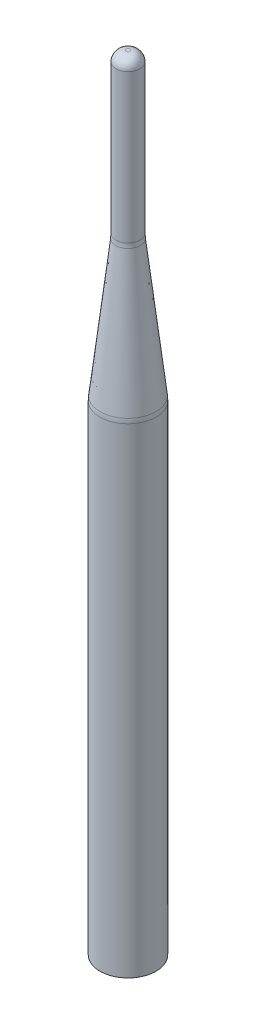
ISO-10303-21;
HEADER;
FILE_DESCRIPTION(('STEP AP214'),'2;1');
FILE_NAME('part.step','',(''),(''),'','','');
FILE_SCHEMA(('AUTOMOTIVE_DESIGN { 1 0 10303 214 1 1 1 1 }'));
ENDSEC;
DATA;
#1=APPLICATION_CONTEXT('core data for automotive mechanical design processes');
#2=APPLICATION_PROTOCOL_DEFINITION('international standard','automotive_design',2000,#1);
#3=PRODUCT_CONTEXT('',#1,'mechanical');
#4=PRODUCT('Part','Part','',(#3));
#5=PRODUCT_RELATED_PRODUCT_CATEGORY('part','',(#4));
#6=PRODUCT_DEFINITION_FORMATION('','',#4);
#7=PRODUCT_DEFINITION_CONTEXT('part definition',#1,'design');
#8=PRODUCT_DEFINITION('design','',#6,#7);
#9=PRODUCT_DEFINITION_SHAPE('','',#8);
#10=(LENGTH_UNIT() NAMED_UNIT(*) SI_UNIT(.MILLI.,.METRE.));
#11=(NAMED_UNIT(*) PLANE_ANGLE_UNIT() SI_UNIT($,.RADIAN.));
#12=(NAMED_UNIT(*) SI_UNIT($,.STERADIAN.) SOLID_ANGLE_UNIT());
#13=UNCERTAINTY_MEASURE_WITH_UNIT(LENGTH_MEASURE(1.E-05),#10,'distance_accuracy_value','');
#14=(GEOMETRIC_REPRESENTATION_CONTEXT(3) GLOBAL_UNCERTAINTY_ASSIGNED_CONTEXT((#13)) GLOBAL_UNIT_ASSIGNED_CONTEXT((#10,
#11,#12)) REPRESENTATION_CONTEXT('',''));
#15=CARTESIAN_POINT('',(0.,0.,0.));
#16=DIRECTION('',(0.,0.,1.));
#17=DIRECTION('',(1.,0.,0.));
#18=AXIS2_PLACEMENT_3D('',#15,#16,#17);
#19=CARTESIAN_POINT('',(0.,0.,0.));
#20=DIRECTION('',(0.,-1.,0.));
#21=DIRECTION('',(0.,0.,-1.));
#22=AXIS2_PLACEMENT_3D('',#19,#20,#21);
#23=PLANE('',#22);
#24=CARTESIAN_POINT('',(0.,0.,0.));
#25=DIRECTION('',(0.,-1.,0.));
#26=DIRECTION('',(0.,0.,-1.));
#27=AXIS2_PLACEMENT_3D('',#24,#25,#26);
#28=CIRCLE('',#27,7.);
#29=CARTESIAN_POINT('',(0.,0.,-7.));
#30=VERTEX_POINT('',#29);
#31=EDGE_CURVE('E10',#30,#30,#28,.T.);
#32=ORIENTED_EDGE('',*,*,#31,.T.);
#33=EDGE_LOOP('',(#32));
#34=FACE_BOUND('',#33,.T.);
#35=ADVANCED_FACE('F30',(#34),#23,.T.);
#36=CARTESIAN_POINT('',(0.,0.,0.));
#37=DIRECTION('',(0.,-1.,0.));
#38=DIRECTION('',(0.,0.,-1.));
#39=AXIS2_PLACEMENT_3D('',#36,#37,#38);
#40=CYLINDRICAL_SURFACE('',#39,7.);
#41=CARTESIAN_POINT('',(0.,119.430425230957,0.));
#42=DIRECTION('',(0.,-1.,0.));
#43=DIRECTION('',(0.,0.,-1.));
#44=AXIS2_PLACEMENT_3D('',#41,#42,#43);
#45=CIRCLE('',#44,7.);
#46=CARTESIAN_POINT('',(0.,119.430425230957,-7.));
#47=VERTEX_POINT('',#46);
#48=EDGE_CURVE('E36',#47,#47,#45,.T.);
#49=ORIENTED_EDGE('',*,*,#48,.T.);
#50=EDGE_LOOP('',(#49));
#51=FACE_BOUND('',#50,.T.);
#52=ORIENTED_EDGE('',*,*,#31,.F.);
#53=EDGE_LOOP('',(#52));
#54=FACE_BOUND('',#53,.T.);
#55=ADVANCED_FACE('F71',(#51,#54),#40,.T.);
#56=CARTESIAN_POINT('',(0.,119.430425230957,0.));
#57=DIRECTION('',(0.,-1.,0.));
#58=DIRECTION('',(0.,0.,-1.));
#59=AXIS2_PLACEMENT_3D('',#56,#57,#58);
#60=DEGENERATE_TOROIDAL_SURFACE('',#59,3.,10.,.F.);
#61=CARTESIAN_POINT('',(0.,120.565891142565,0.));
#62=DIRECTION('',(0.,-1.,0.));
#63=DIRECTION('',(0.,0.,-1.));
#64=AXIS2_PLACEMENT_3D('',#61,#62,#63);
#65=CIRCLE('',#64,6.93532672656404);
#66=CARTESIAN_POINT('',(0.,120.565891142565,-6.93532672656404));
#67=VERTEX_POINT('',#66);
#68=EDGE_CURVE('E40',#67,#67,#65,.T.);
#69=ORIENTED_EDGE('',*,*,#68,.T.);
#70=EDGE_LOOP('',(#69));
#71=FACE_BOUND('',#70,.T.);
#72=ORIENTED_EDGE('',*,*,#48,.F.);
#73=EDGE_LOOP('',(#72));
#74=FACE_BOUND('',#73,.T.);
#75=ADVANCED_FACE('F75',(#71,#74),#60,.F.);
#76=CARTESIAN_POINT('',(0.,120.565891142565,0.));
#77=DIRECTION('',(0.,-1.,0.));
#78=DIRECTION('',(0.,0.,-1.));
#79=AXIS2_PLACEMENT_3D('',#76,#77,#78);
#80=CONICAL_SURFACE('',#79,6.93532672656404,0.113792007143708);
#81=CARTESIAN_POINT('',(0.,154.434108857435,0.));
#82=DIRECTION('',(0.,-1.,0.));
#83=DIRECTION('',(0.,0.,-1.));
#84=AXIS2_PLACEMENT_3D('',#81,#82,#83);
#85=CIRCLE('',#84,3.06467327343596);
#86=CARTESIAN_POINT('',(0.,154.434108857435,-3.06467327343596));
#87=VERTEX_POINT('',#86);
#88=EDGE_CURVE('E44',#87,#87,#85,.T.);
#89=ORIENTED_EDGE('',*,*,#88,.T.);
#90=EDGE_LOOP('',(#89));
#91=FACE_BOUND('',#90,.T.);
#92=ORIENTED_EDGE('',*,*,#68,.F.);
#93=EDGE_LOOP('',(#92));
#94=FACE_BOUND('',#93,.T.);
#95=ADVANCED_FACE('F79',(#91,#94),#80,.T.);
#96=CARTESIAN_POINT('',(0.,155.569574769043,0.));
#97=DIRECTION('',(0.,-1.,0.));
#98=DIRECTION('',(0.,0.,-1.));
#99=AXIS2_PLACEMENT_3D('',#96,#97,#98);
#100=TOROIDAL_SURFACE('',#99,13.,10.);
#101=CARTESIAN_POINT('',(0.,155.569574769043,0.));
#102=DIRECTION('',(0.,-1.,0.));
#103=DIRECTION('',(0.,0.,-1.));
#104=AXIS2_PLACEMENT_3D('',#101,#102,#103);
#105=CIRCLE('',#104,3.00000000000001);
#106=CARTESIAN_POINT('',(0.,155.569574769043,-3.00000000000001));
#107=VERTEX_POINT('',#106);
#108=EDGE_CURVE('E49',#107,#107,#105,.T.);
#109=ORIENTED_EDGE('',*,*,#108,.T.);
#110=EDGE_LOOP('',(#109));
#111=FACE_BOUND('',#110,.T.);
#112=ORIENTED_EDGE('',*,*,#88,.F.);
#113=EDGE_LOOP('',(#112));
#114=FACE_BOUND('',#113,.T.);
#115=ADVANCED_FACE('F86',(#111,#114),#100,.F.);
#116=CARTESIAN_POINT('',(0.,0.,0.));
#117=DIRECTION('',(0.,-1.,0.));
#118=DIRECTION('',(0.,0.,-1.));
#119=AXIS2_PLACEMENT_3D('',#116,#117,#118);
#120=CYLINDRICAL_SURFACE('',#119,3.);
#121=CARTESIAN_POINT('',(0.,192.5,0.));
#122=DIRECTION('',(0.,-1.,0.));
#123=DIRECTION('',(0.,0.,-1.));
#124=AXIS2_PLACEMENT_3D('',#121,#122,#123);
#125=CIRCLE('',#124,3.);
#126=CARTESIAN_POINT('',(0.,192.5,-3.));
#127=VERTEX_POINT('',#126);
#128=EDGE_CURVE('E52',#127,#127,#125,.T.);
#129=ORIENTED_EDGE('',*,*,#128,.T.);
#130=EDGE_LOOP('',(#129));
#131=FACE_BOUND('',#130,.T.);
#132=ORIENTED_EDGE('',*,*,#108,.F.);
#133=EDGE_LOOP('',(#132));
#134=FACE_BOUND('',#133,.T.);
#135=ADVANCED_FACE('F68',(#131,#134),#120,.T.);
#136=CARTESIAN_POINT('',(0.,192.5,0.));
#137=DIRECTION('',(0.,-1.,0.));
#138=DIRECTION('',(0.,0.,-1.));
#139=AXIS2_PLACEMENT_3D('',#136,#137,#138);
#140=DEGENERATE_TOROIDAL_SURFACE('',#139,0.5,2.5,.T.);
#141=CARTESIAN_POINT('',(0.,195.,0.));
#142=DIRECTION('',(0.,-1.,0.));
#143=DIRECTION('',(0.,0.,-1.));
#144=AXIS2_PLACEMENT_3D('',#141,#142,#143);
#145=CIRCLE('',#144,0.499999999999982);
#146=CARTESIAN_POINT('',(0.,195.,-0.499999999999982));
#147=VERTEX_POINT('',#146);
#148=EDGE_CURVE('E55',#147,#147,#145,.T.);
#149=ORIENTED_EDGE('',*,*,#148,.T.);
#150=EDGE_LOOP('',(#149));
#151=FACE_BOUND('',#150,.T.);
#152=ORIENTED_EDGE('',*,*,#128,.F.);
#153=EDGE_LOOP('',(#152));
#154=FACE_BOUND('',#153,.T.);
#155=ADVANCED_FACE('F59',(#151,#154),#140,.T.);
#156=CARTESIAN_POINT('',(0.,195.,0.));
#157=DIRECTION('',(0.,1.,0.));
#158=DIRECTION('',(0.,0.,1.));
#159=AXIS2_PLACEMENT_3D('',#156,#157,#158);
#160=PLANE('',#159);
#161=ORIENTED_EDGE('',*,*,#148,.F.);
#162=EDGE_LOOP('',(#161));
#163=FACE_BOUND('',#162,.T.);
#164=ADVANCED_FACE('F62',(#163),#160,.T.);
#165=CLOSED_SHELL('',(#35,#55,#75,#95,#115,#135,#155,#164));
#166=MANIFOLD_SOLID_BREP('B2',#165);
#167=ADVANCED_BREP_SHAPE_REPRESENTATION('',(#18,#166),#14);
#168=SHAPE_DEFINITION_REPRESENTATION(#9,#167);
ENDSEC;
END-ISO-10303-21;
